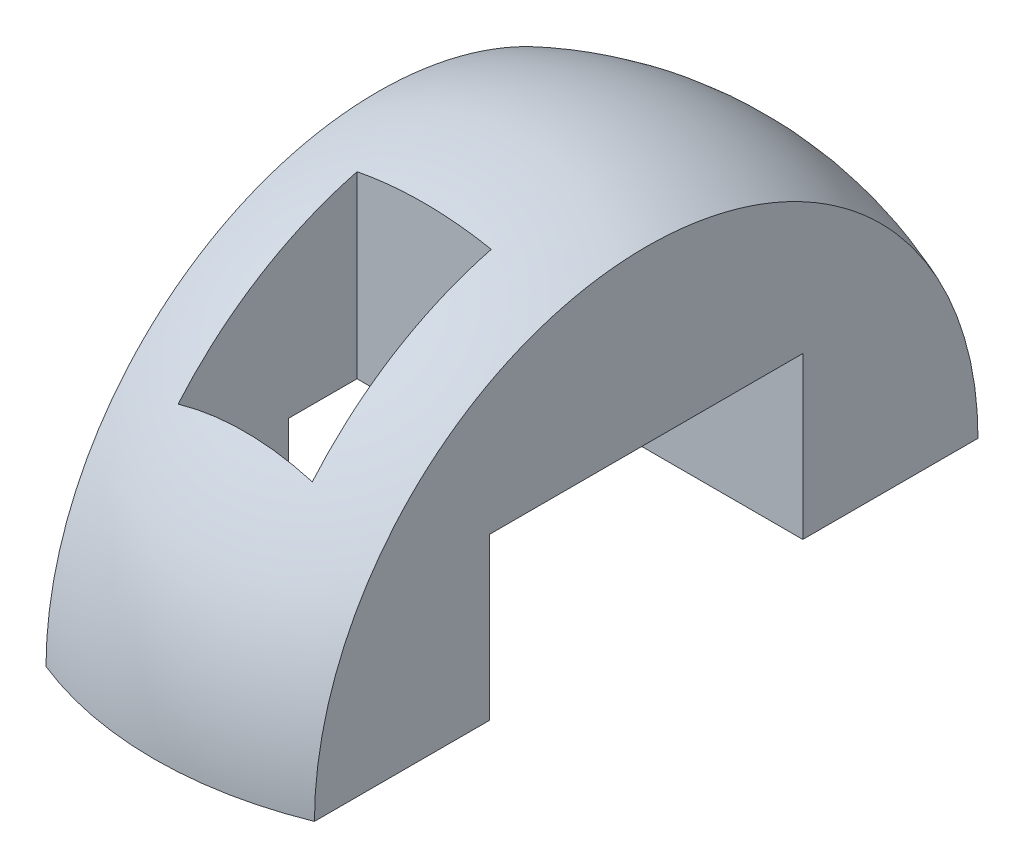
ISO-10303-21;
HEADER;
FILE_DESCRIPTION(('STEP AP214'),'2;1');
FILE_NAME('part.step','',(''),(''),'','','');
FILE_SCHEMA(('AUTOMOTIVE_DESIGN { 1 0 10303 214 1 1 1 1 }'));
ENDSEC;
DATA;
#1=APPLICATION_CONTEXT('core data for automotive mechanical design processes');
#2=APPLICATION_PROTOCOL_DEFINITION('international standard','automotive_design',2000,#1);
#3=PRODUCT_CONTEXT('',#1,'mechanical');
#4=PRODUCT('Part','Part','',(#3));
#5=PRODUCT_RELATED_PRODUCT_CATEGORY('part','',(#4));
#6=PRODUCT_DEFINITION_FORMATION('','',#4);
#7=PRODUCT_DEFINITION_CONTEXT('part definition',#1,'design');
#8=PRODUCT_DEFINITION('design','',#6,#7);
#9=PRODUCT_DEFINITION_SHAPE('','',#8);
#10=(LENGTH_UNIT() NAMED_UNIT(*) SI_UNIT(.MILLI.,.METRE.));
#11=(NAMED_UNIT(*) PLANE_ANGLE_UNIT() SI_UNIT($,.RADIAN.));
#12=(NAMED_UNIT(*) SI_UNIT($,.STERADIAN.) SOLID_ANGLE_UNIT());
#13=UNCERTAINTY_MEASURE_WITH_UNIT(LENGTH_MEASURE(1.E-05),#10,'distance_accuracy_value','');
#14=(GEOMETRIC_REPRESENTATION_CONTEXT(3) GLOBAL_UNCERTAINTY_ASSIGNED_CONTEXT((#13)) GLOBAL_UNIT_ASSIGNED_CONTEXT((#10,
#11,#12)) REPRESENTATION_CONTEXT('',''));
#15=CARTESIAN_POINT('',(0.,0.,0.));
#16=DIRECTION('',(0.,0.,1.));
#17=DIRECTION('',(1.,0.,0.));
#18=AXIS2_PLACEMENT_3D('',#15,#16,#17);
#19=CARTESIAN_POINT('',(0.,0.,0.));
#20=DIRECTION('',(0.,-1.,0.));
#21=DIRECTION('',(0.,0.,-1.));
#22=AXIS2_PLACEMENT_3D('',#19,#20,#21);
#23=PLANE('',#22);
#24=DIRECTION('',(-1.,0.,0.));
#25=VECTOR('',#24,1.);
#26=CARTESIAN_POINT('',(30.,0.,35.));
#27=LINE('',#26,#25);
#28=CARTESIAN_POINT('',(-14.9240577708063,0.,35.));
#29=VERTEX_POINT('',#28);
#30=CARTESIAN_POINT('',(-30.,0.,35.));
#31=VERTEX_POINT('',#30);
#32=EDGE_CURVE('E220',#29,#31,#27,.T.);
#33=ORIENTED_EDGE('',*,*,#32,.F.);
#34=DIRECTION('',(0.,0.,-1.));
#35=VECTOR('',#34,1.);
#36=CARTESIAN_POINT('',(-14.9240577708063,0.,59.7170206114934));
#37=LINE('',#36,#35);
#38=CARTESIAN_POINT('',(-14.9240577708063,0.,59.7170206114934));
#39=VERTEX_POINT('',#38);
#40=EDGE_CURVE('E147',#39,#29,#37,.T.);
#41=ORIENTED_EDGE('',*,*,#40,.F.);
#42=DIRECTION('',(-1.,0.,0.));
#43=VECTOR('',#42,1.);
#44=CARTESIAN_POINT('',(-14.9240577708063,0.,59.7170206114934));
#45=LINE('',#44,#43);
#46=CARTESIAN_POINT('',(15.0759422291937,0.,59.7170206114934));
#47=VERTEX_POINT('',#46);
#48=EDGE_CURVE('E146',#47,#39,#45,.T.);
#49=ORIENTED_EDGE('',*,*,#48,.F.);
#50=DIRECTION('',(0.,0.,1.));
#51=VECTOR('',#50,1.);
#52=CARTESIAN_POINT('',(15.0759422291937,0.,59.7170206114934));
#53=LINE('',#52,#51);
#54=CARTESIAN_POINT('',(15.0759422291937,0.,35.));
#55=VERTEX_POINT('',#54);
#56=EDGE_CURVE('E135',#55,#47,#53,.T.);
#57=ORIENTED_EDGE('',*,*,#56,.F.);
#58=CARTESIAN_POINT('',(30.,0.,35.));
#59=VERTEX_POINT('',#58);
#60=EDGE_CURVE('E217',#59,#55,#27,.T.);
#61=ORIENTED_EDGE('',*,*,#60,.F.);
#62=DIRECTION('',(0.,0.,1.));
#63=VECTOR('',#62,1.);
#64=CARTESIAN_POINT('',(30.,0.,-80.));
#65=LINE('',#64,#63);
#66=CARTESIAN_POINT('',(30.,0.,74.1619848709566));
#67=VERTEX_POINT('',#66);
#68=EDGE_CURVE('E229',#59,#67,#65,.T.);
#69=ORIENTED_EDGE('',*,*,#68,.T.);
#70=CARTESIAN_POINT('',(0.,0.,0.));
#71=DIRECTION('',(0.,-1.,0.));
#72=DIRECTION('',(0.,0.,-1.));
#73=AXIS2_PLACEMENT_3D('',#70,#71,#72);
#74=CIRCLE('',#73,80.);
#75=CARTESIAN_POINT('',(-30.,0.,74.1619848709566));
#76=VERTEX_POINT('',#75);
#77=EDGE_CURVE('E237',#67,#76,#74,.T.);
#78=ORIENTED_EDGE('',*,*,#77,.T.);
#79=DIRECTION('',(0.,0.,1.));
#80=VECTOR('',#79,1.);
#81=CARTESIAN_POINT('',(-30.,0.,-80.));
#82=LINE('',#81,#80);
#83=EDGE_CURVE('E211',#31,#76,#82,.T.);
#84=ORIENTED_EDGE('',*,*,#83,.F.);
#85=EDGE_LOOP('',(#33,#41,#49,#57,#61,#69,#78,#84));
#86=FACE_BOUND('',#85,.T.);
#87=ADVANCED_FACE('F46',(#86),#23,.T.);
#88=CARTESIAN_POINT('',(0.,0.,0.));
#89=DIRECTION('',(0.,-1.,0.));
#90=DIRECTION('',(1.,0.,0.));
#91=AXIS2_PLACEMENT_3D('',#88,#89,#90);
#92=SPHERICAL_SURFACE('',#91,80.);
#93=ORIENTED_EDGE('',*,*,#77,.F.);
#94=CARTESIAN_POINT('',(30.,0.,0.));
#95=DIRECTION('',(1.,0.,0.));
#96=DIRECTION('',(0.,0.,-1.));
#97=AXIS2_PLACEMENT_3D('',#94,#95,#96);
#98=CIRCLE('',#97,74.1619848709566);
#99=CARTESIAN_POINT('',(30.,0.,-74.1619848709566));
#100=VERTEX_POINT('',#99);
#101=EDGE_CURVE('E241',#67,#100,#98,.F.);
#102=ORIENTED_EDGE('',*,*,#101,.T.);
#103=CARTESIAN_POINT('',(-30.,0.,-74.1619848709566));
#104=VERTEX_POINT('',#103);
#105=EDGE_CURVE('E228',#104,#100,#74,.T.);
#106=ORIENTED_EDGE('',*,*,#105,.F.);
#107=CARTESIAN_POINT('',(-30.,0.,0.));
#108=DIRECTION('',(1.,0.,0.));
#109=DIRECTION('',(0.,0.,-1.));
#110=AXIS2_PLACEMENT_3D('',#107,#108,#109);
#111=CIRCLE('',#110,74.1619848709566);
#112=EDGE_CURVE('E238',#76,#104,#111,.F.);
#113=ORIENTED_EDGE('',*,*,#112,.F.);
#114=EDGE_LOOP('',(#93,#102,#106,#113));
#115=FACE_BOUND('',#114,.T.);
#116=CARTESIAN_POINT('',(0.,0.,59.7170206114934));
#117=DIRECTION('',(0.,0.,-1.));
#118=DIRECTION('',(-1.,0.,0.));
#119=AXIS2_PLACEMENT_3D('',#116,#117,#118);
#120=CIRCLE('',#119,53.2341755762825);
#121=CARTESIAN_POINT('',(15.0759422291937,51.0548079536931,59.7170206114934));
#122=VERTEX_POINT('',#121);
#123=CARTESIAN_POINT('',(-14.9240577708063,51.0994124128654,59.7170206114934));
#124=VERTEX_POINT('',#123);
#125=EDGE_CURVE('E11',#122,#124,#120,.F.);
#126=ORIENTED_EDGE('',*,*,#125,.T.);
#127=CARTESIAN_POINT('',(-14.9240577708063,0.,0.));
#128=DIRECTION('',(1.,0.,0.));
#129=DIRECTION('',(0.,0.,-1.));
#130=AXIS2_PLACEMENT_3D('',#127,#128,#129);
#131=CIRCLE('',#130,78.5956264664494);
#132=CARTESIAN_POINT('',(-14.9240577708063,76.082268616673,19.7170206114934));
#133=VERTEX_POINT('',#132);
#134=EDGE_CURVE('E176',#124,#133,#131,.F.);
#135=ORIENTED_EDGE('',*,*,#134,.T.);
#136=CARTESIAN_POINT('',(0.,0.,19.7170206114934));
#137=DIRECTION('',(0.,0.,1.));
#138=DIRECTION('',(1.,0.,0.));
#139=AXIS2_PLACEMENT_3D('',#136,#137,#138);
#140=CIRCLE('',#139,77.5321810489421);
#141=CARTESIAN_POINT('',(15.0759422291937,76.0523179404018,19.7170206114934));
#142=VERTEX_POINT('',#141);
#143=EDGE_CURVE('E180',#133,#142,#140,.F.);
#144=ORIENTED_EDGE('',*,*,#143,.T.);
#145=CARTESIAN_POINT('',(15.0759422291937,0.,0.));
#146=DIRECTION('',(-1.,0.,0.));
#147=DIRECTION('',(0.,0.,1.));
#148=AXIS2_PLACEMENT_3D('',#145,#146,#147);
#149=CIRCLE('',#148,78.5666339224356);
#150=EDGE_CURVE('E170',#142,#122,#149,.F.);
#151=ORIENTED_EDGE('',*,*,#150,.T.);
#152=EDGE_LOOP('',(#126,#135,#144,#151));
#153=FACE_BOUND('',#152,.T.);
#154=ADVANCED_FACE('F284',(#115,#153),#92,.T.);
#155=CARTESIAN_POINT('',(30.,36.,0.));
#156=DIRECTION('',(0.,1.,0.));
#157=DIRECTION('',(0.,0.,1.));
#158=AXIS2_PLACEMENT_3D('',#155,#156,#157);
#159=PLANE('',#158);
#160=DIRECTION('',(0.,0.,-1.));
#161=VECTOR('',#160,1.);
#162=CARTESIAN_POINT('',(-14.9240577708063,36.,0.));
#163=LINE('',#162,#161);
#164=CARTESIAN_POINT('',(-14.9240577708063,36.,35.));
#165=VERTEX_POINT('',#164);
#166=CARTESIAN_POINT('',(-14.9240577708063,36.,19.7170206114934));
#167=VERTEX_POINT('',#166);
#168=EDGE_CURVE('E173',#165,#167,#163,.T.);
#169=ORIENTED_EDGE('',*,*,#168,.F.);
#170=DIRECTION('',(-1.,0.,0.));
#171=VECTOR('',#170,1.);
#172=CARTESIAN_POINT('',(30.,36.,35.));
#173=LINE('',#172,#171);
#174=CARTESIAN_POINT('',(-30.,36.,35.));
#175=VERTEX_POINT('',#174);
#176=EDGE_CURVE('E216',#165,#175,#173,.T.);
#177=ORIENTED_EDGE('',*,*,#176,.T.);
#178=DIRECTION('',(0.,0.,-1.));
#179=VECTOR('',#178,1.);
#180=CARTESIAN_POINT('',(-30.,36.,0.));
#181=LINE('',#180,#179);
#182=CARTESIAN_POINT('',(-30.,36.,-35.));
#183=VERTEX_POINT('',#182);
#184=EDGE_CURVE('E189',#175,#183,#181,.T.);
#185=ORIENTED_EDGE('',*,*,#184,.T.);
#186=DIRECTION('',(-1.,0.,0.));
#187=VECTOR('',#186,1.);
#188=CARTESIAN_POINT('',(30.,36.,-35.));
#189=LINE('',#188,#187);
#190=CARTESIAN_POINT('',(30.,36.,-35.));
#191=VERTEX_POINT('',#190);
#192=EDGE_CURVE('E208',#191,#183,#189,.T.);
#193=ORIENTED_EDGE('',*,*,#192,.F.);
#194=DIRECTION('',(0.,0.,-1.));
#195=VECTOR('',#194,1.);
#196=CARTESIAN_POINT('',(30.,36.,0.));
#197=LINE('',#196,#195);
#198=CARTESIAN_POINT('',(30.,36.,35.));
#199=VERTEX_POINT('',#198);
#200=EDGE_CURVE('E193',#199,#191,#197,.T.);
#201=ORIENTED_EDGE('',*,*,#200,.F.);
#202=CARTESIAN_POINT('',(15.0759422291937,36.,35.));
#203=VERTEX_POINT('',#202);
#204=EDGE_CURVE('E212',#199,#203,#173,.T.);
#205=ORIENTED_EDGE('',*,*,#204,.T.);
#206=DIRECTION('',(0.,0.,1.));
#207=VECTOR('',#206,1.);
#208=CARTESIAN_POINT('',(15.0759422291937,36.,0.));
#209=LINE('',#208,#207);
#210=CARTESIAN_POINT('',(15.0759422291937,36.,19.7170206114934));
#211=VERTEX_POINT('',#210);
#212=EDGE_CURVE('E69',#211,#203,#209,.T.);
#213=ORIENTED_EDGE('',*,*,#212,.F.);
#214=DIRECTION('',(1.,0.,0.));
#215=VECTOR('',#214,1.);
#216=CARTESIAN_POINT('',(30.,36.,19.7170206114934));
#217=LINE('',#216,#215);
#218=EDGE_CURVE('E54',#167,#211,#217,.T.);
#219=ORIENTED_EDGE('',*,*,#218,.F.);
#220=EDGE_LOOP('',(#169,#177,#185,#193,#201,#205,#213,#219));
#221=FACE_BOUND('',#220,.T.);
#222=ADVANCED_FACE('F256',(#221),#159,.F.);
#223=CARTESIAN_POINT('',(30.,0.,35.));
#224=DIRECTION('',(0.,0.,1.));
#225=DIRECTION('',(1.,0.,0.));
#226=AXIS2_PLACEMENT_3D('',#223,#224,#225);
#227=PLANE('',#226);
#228=DIRECTION('',(0.,1.,0.));
#229=VECTOR('',#228,1.);
#230=CARTESIAN_POINT('',(-14.9240577708063,0.,35.));
#231=LINE('',#230,#229);
#232=EDGE_CURVE('E247',#29,#165,#231,.T.);
#233=ORIENTED_EDGE('',*,*,#232,.F.);
#234=ORIENTED_EDGE('',*,*,#32,.T.);
#235=DIRECTION('',(0.,1.,0.));
#236=VECTOR('',#235,1.);
#237=CARTESIAN_POINT('',(-30.,0.,35.));
#238=LINE('',#237,#236);
#239=EDGE_CURVE('E201',#31,#175,#238,.T.);
#240=ORIENTED_EDGE('',*,*,#239,.T.);
#241=ORIENTED_EDGE('',*,*,#176,.F.);
#242=EDGE_LOOP('',(#233,#234,#240,#241));
#243=FACE_BOUND('',#242,.T.);
#244=ADVANCED_FACE('F275',(#243),#227,.F.);
#245=DIRECTION('',(0.,-1.,0.));
#246=VECTOR('',#245,1.);
#247=CARTESIAN_POINT('',(15.0759422291937,0.,35.));
#248=LINE('',#247,#246);
#249=EDGE_CURVE('E140',#203,#55,#248,.T.);
#250=ORIENTED_EDGE('',*,*,#249,.F.);
#251=ORIENTED_EDGE('',*,*,#204,.F.);
#252=DIRECTION('',(0.,1.,0.));
#253=VECTOR('',#252,1.);
#254=CARTESIAN_POINT('',(30.,0.,35.));
#255=LINE('',#254,#253);
#256=EDGE_CURVE('E188',#59,#199,#255,.T.);
#257=ORIENTED_EDGE('',*,*,#256,.F.);
#258=ORIENTED_EDGE('',*,*,#60,.T.);
#259=EDGE_LOOP('',(#250,#251,#257,#258));
#260=FACE_BOUND('',#259,.T.);
#261=ADVANCED_FACE('F260',(#260),#227,.F.);
#262=CARTESIAN_POINT('',(30.,0.,-35.));
#263=VERTEX_POINT('',#262);
#264=EDGE_CURVE('E224',#100,#263,#65,.T.);
#265=ORIENTED_EDGE('',*,*,#264,.T.);
#266=DIRECTION('',(-1.,0.,0.));
#267=VECTOR('',#266,1.);
#268=CARTESIAN_POINT('',(30.,0.,-35.));
#269=LINE('',#268,#267);
#270=CARTESIAN_POINT('',(-30.,0.,-35.));
#271=VERTEX_POINT('',#270);
#272=EDGE_CURVE('E197',#263,#271,#269,.T.);
#273=ORIENTED_EDGE('',*,*,#272,.T.);
#274=EDGE_CURVE('E230',#104,#271,#82,.T.);
#275=ORIENTED_EDGE('',*,*,#274,.F.);
#276=ORIENTED_EDGE('',*,*,#105,.T.);
#277=EDGE_LOOP('',(#265,#273,#275,#276));
#278=FACE_BOUND('',#277,.T.);
#279=ADVANCED_FACE('F289',(#278),#23,.T.);
#280=CARTESIAN_POINT('',(-30.,0.,-80.));
#281=DIRECTION('',(1.,0.,0.));
#282=DIRECTION('',(0.,0.,-1.));
#283=AXIS2_PLACEMENT_3D('',#280,#281,#282);
#284=PLANE('',#283);
#285=DIRECTION('',(0.,1.,0.));
#286=VECTOR('',#285,1.);
#287=CARTESIAN_POINT('',(-30.,0.,-35.));
#288=LINE('',#287,#286);
#289=EDGE_CURVE('E184',#271,#183,#288,.T.);
#290=ORIENTED_EDGE('',*,*,#289,.T.);
#291=ORIENTED_EDGE('',*,*,#184,.F.);
#292=ORIENTED_EDGE('',*,*,#239,.F.);
#293=ORIENTED_EDGE('',*,*,#83,.T.);
#294=ORIENTED_EDGE('',*,*,#112,.T.);
#295=ORIENTED_EDGE('',*,*,#274,.T.);
#296=EDGE_LOOP('',(#290,#291,#292,#293,#294,#295));
#297=FACE_BOUND('',#296,.T.);
#298=ADVANCED_FACE('F280',(#297),#284,.F.);
#299=CARTESIAN_POINT('',(30.,0.,-80.));
#300=DIRECTION('',(1.,0.,0.));
#301=DIRECTION('',(0.,0.,-1.));
#302=AXIS2_PLACEMENT_3D('',#299,#300,#301);
#303=PLANE('',#302);
#304=ORIENTED_EDGE('',*,*,#200,.T.);
#305=DIRECTION('',(0.,1.,0.));
#306=VECTOR('',#305,1.);
#307=CARTESIAN_POINT('',(30.,0.,-35.));
#308=LINE('',#307,#306);
#309=EDGE_CURVE('E185',#263,#191,#308,.T.);
#310=ORIENTED_EDGE('',*,*,#309,.F.);
#311=ORIENTED_EDGE('',*,*,#264,.F.);
#312=ORIENTED_EDGE('',*,*,#101,.F.);
#313=ORIENTED_EDGE('',*,*,#68,.F.);
#314=ORIENTED_EDGE('',*,*,#256,.T.);
#315=EDGE_LOOP('',(#304,#310,#311,#312,#313,#314));
#316=FACE_BOUND('',#315,.T.);
#317=ADVANCED_FACE('F263',(#316),#303,.T.);
#318=CARTESIAN_POINT('',(30.,0.,-35.));
#319=DIRECTION('',(0.,0.,1.));
#320=DIRECTION('',(1.,0.,0.));
#321=AXIS2_PLACEMENT_3D('',#318,#319,#320);
#322=PLANE('',#321);
#323=ORIENTED_EDGE('',*,*,#289,.F.);
#324=ORIENTED_EDGE('',*,*,#272,.F.);
#325=ORIENTED_EDGE('',*,*,#309,.T.);
#326=ORIENTED_EDGE('',*,*,#192,.T.);
#327=EDGE_LOOP('',(#323,#324,#325,#326));
#328=FACE_BOUND('',#327,.T.);
#329=ADVANCED_FACE('F291',(#328),#322,.T.);
#330=CARTESIAN_POINT('',(-14.9240577708063,0.,19.7170206114934));
#331=DIRECTION('',(0.,0.,1.));
#332=DIRECTION('',(1.,0.,0.));
#333=AXIS2_PLACEMENT_3D('',#330,#331,#332);
#334=PLANE('',#333);
#335=DIRECTION('',(0.,1.,0.));
#336=VECTOR('',#335,1.);
#337=CARTESIAN_POINT('',(-14.9240577708063,0.,19.7170206114934));
#338=LINE('',#337,#336);
#339=EDGE_CURVE('E164',#167,#133,#338,.T.);
#340=ORIENTED_EDGE('',*,*,#339,.F.);
#341=ORIENTED_EDGE('',*,*,#218,.T.);
#342=DIRECTION('',(0.,1.,0.));
#343=VECTOR('',#342,1.);
#344=CARTESIAN_POINT('',(15.0759422291937,0.,19.7170206114934));
#345=LINE('',#344,#343);
#346=EDGE_CURVE('E151',#211,#142,#345,.T.);
#347=ORIENTED_EDGE('',*,*,#346,.T.);
#348=ORIENTED_EDGE('',*,*,#143,.F.);
#349=EDGE_LOOP('',(#340,#341,#347,#348));
#350=FACE_BOUND('',#349,.T.);
#351=ADVANCED_FACE('F253',(#350),#334,.T.);
#352=CARTESIAN_POINT('',(-14.9240577708063,0.,59.7170206114934));
#353=DIRECTION('',(1.,0.,0.));
#354=DIRECTION('',(0.,0.,-1.));
#355=AXIS2_PLACEMENT_3D('',#352,#353,#354);
#356=PLANE('',#355);
#357=DIRECTION('',(0.,1.,0.));
#358=VECTOR('',#357,1.);
#359=CARTESIAN_POINT('',(-14.9240577708063,0.,59.7170206114934));
#360=LINE('',#359,#358);
#361=EDGE_CURVE('E61',#39,#124,#360,.T.);
#362=ORIENTED_EDGE('',*,*,#361,.F.);
#363=ORIENTED_EDGE('',*,*,#40,.T.);
#364=ORIENTED_EDGE('',*,*,#232,.T.);
#365=ORIENTED_EDGE('',*,*,#168,.T.);
#366=ORIENTED_EDGE('',*,*,#339,.T.);
#367=ORIENTED_EDGE('',*,*,#134,.F.);
#368=EDGE_LOOP('',(#362,#363,#364,#365,#366,#367));
#369=FACE_BOUND('',#368,.T.);
#370=ADVANCED_FACE('F293',(#369),#356,.T.);
#371=CARTESIAN_POINT('',(15.0759422291937,0.,59.7170206114934));
#372=DIRECTION('',(-1.,0.,0.));
#373=DIRECTION('',(0.,0.,1.));
#374=AXIS2_PLACEMENT_3D('',#371,#372,#373);
#375=PLANE('',#374);
#376=ORIENTED_EDGE('',*,*,#346,.F.);
#377=ORIENTED_EDGE('',*,*,#212,.T.);
#378=ORIENTED_EDGE('',*,*,#249,.T.);
#379=ORIENTED_EDGE('',*,*,#56,.T.);
#380=DIRECTION('',(0.,1.,0.));
#381=VECTOR('',#380,1.);
#382=CARTESIAN_POINT('',(15.0759422291937,0.,59.7170206114934));
#383=LINE('',#382,#381);
#384=EDGE_CURVE('E138',#47,#122,#383,.T.);
#385=ORIENTED_EDGE('',*,*,#384,.T.);
#386=ORIENTED_EDGE('',*,*,#150,.F.);
#387=EDGE_LOOP('',(#376,#377,#378,#379,#385,#386));
#388=FACE_BOUND('',#387,.T.);
#389=ADVANCED_FACE('F137',(#388),#375,.T.);
#390=CARTESIAN_POINT('',(-14.9240577708063,0.,59.7170206114934));
#391=DIRECTION('',(0.,0.,-1.));
#392=DIRECTION('',(-1.,0.,0.));
#393=AXIS2_PLACEMENT_3D('',#390,#391,#392);
#394=PLANE('',#393);
#395=ORIENTED_EDGE('',*,*,#384,.F.);
#396=ORIENTED_EDGE('',*,*,#48,.T.);
#397=ORIENTED_EDGE('',*,*,#361,.T.);
#398=ORIENTED_EDGE('',*,*,#125,.F.);
#399=EDGE_LOOP('',(#395,#396,#397,#398));
#400=FACE_BOUND('',#399,.T.);
#401=ADVANCED_FACE('F149',(#400),#394,.T.);
#402=CLOSED_SHELL('',(#87,#154,#222,#244,#261,#279,#298,#317,#329,#351,#370,#389,#401));
#403=MANIFOLD_SOLID_BREP('B2',#402);
#404=ADVANCED_BREP_SHAPE_REPRESENTATION('',(#18,#403),#14);
#405=SHAPE_DEFINITION_REPRESENTATION(#9,#404);
ENDSEC;
END-ISO-10303-21;
